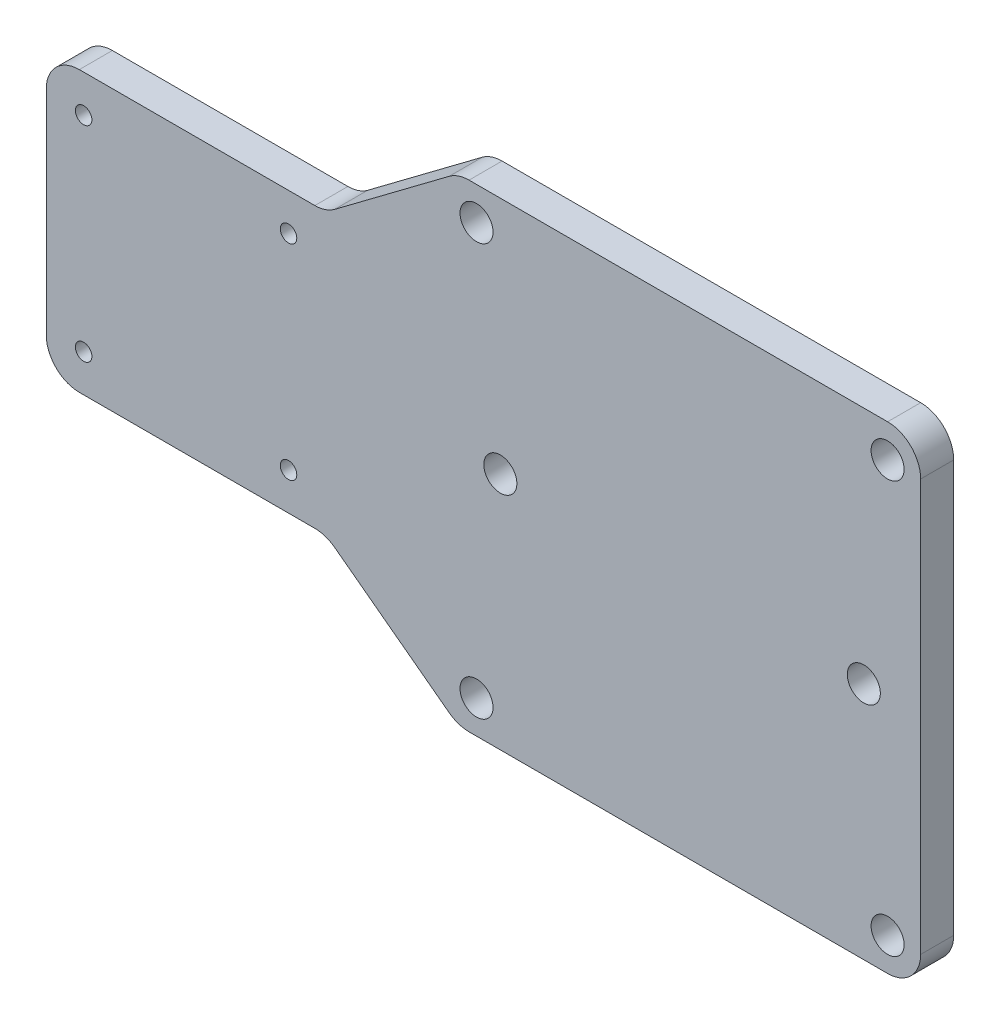
ISO-10303-21;
HEADER;
FILE_DESCRIPTION(('STEP AP214'),'2;1');
FILE_NAME('part.step','',(''),(''),'','','');
FILE_SCHEMA(('AUTOMOTIVE_DESIGN { 1 0 10303 214 1 1 1 1 }'));
ENDSEC;
DATA;
#1=APPLICATION_CONTEXT('core data for automotive mechanical design processes');
#2=APPLICATION_PROTOCOL_DEFINITION('international standard','automotive_design',2000,#1);
#3=PRODUCT_CONTEXT('',#1,'mechanical');
#4=PRODUCT('Part','Part','',(#3));
#5=PRODUCT_RELATED_PRODUCT_CATEGORY('part','',(#4));
#6=PRODUCT_DEFINITION_FORMATION('','',#4);
#7=PRODUCT_DEFINITION_CONTEXT('part definition',#1,'design');
#8=PRODUCT_DEFINITION('design','',#6,#7);
#9=PRODUCT_DEFINITION_SHAPE('','',#8);
#10=(LENGTH_UNIT() NAMED_UNIT(*) SI_UNIT(.MILLI.,.METRE.));
#11=(NAMED_UNIT(*) PLANE_ANGLE_UNIT() SI_UNIT($,.RADIAN.));
#12=(NAMED_UNIT(*) SI_UNIT($,.STERADIAN.) SOLID_ANGLE_UNIT());
#13=UNCERTAINTY_MEASURE_WITH_UNIT(LENGTH_MEASURE(1.E-05),#10,'distance_accuracy_value','');
#14=(GEOMETRIC_REPRESENTATION_CONTEXT(3) GLOBAL_UNCERTAINTY_ASSIGNED_CONTEXT((#13)) GLOBAL_UNIT_ASSIGNED_CONTEXT((#10,
#11,#12)) REPRESENTATION_CONTEXT('',''));
#15=CARTESIAN_POINT('',(0.,0.,0.));
#16=DIRECTION('',(0.,0.,1.));
#17=DIRECTION('',(1.,0.,0.));
#18=AXIS2_PLACEMENT_3D('',#15,#16,#17);
#19=CARTESIAN_POINT('',(-21.15,21.15,5.));
#20=DIRECTION('',(0.,-1.,0.));
#21=DIRECTION('',(0.,0.,-1.));
#22=AXIS2_PLACEMENT_3D('',#19,#20,#21);
#23=PLANE('',#22);
#24=DIRECTION('',(-1.,0.,0.));
#25=VECTOR('',#24,1.);
#26=CARTESIAN_POINT('',(-21.15,21.15,5.));
#27=LINE('',#26,#25);
#28=CARTESIAN_POINT('',(19.4833333333333,21.15,5.));
#29=VERTEX_POINT('',#28);
#30=CARTESIAN_POINT('',(-16.15,21.15,5.));
#31=VERTEX_POINT('',#30);
#32=EDGE_CURVE('E188',#29,#31,#27,.T.);
#33=ORIENTED_EDGE('',*,*,#32,.F.);
#34=DIRECTION('',(0.,0.,-1.));
#35=VECTOR('',#34,1.);
#36=CARTESIAN_POINT('',(19.4833333333333,21.15,0.));
#37=LINE('',#36,#35);
#38=CARTESIAN_POINT('',(19.4833333333333,21.15,0.));
#39=VERTEX_POINT('',#38);
#40=EDGE_CURVE('E204',#29,#39,#37,.T.);
#41=ORIENTED_EDGE('',*,*,#40,.T.);
#42=DIRECTION('',(-1.,0.,0.));
#43=VECTOR('',#42,1.);
#44=CARTESIAN_POINT('',(-21.15,21.15,0.));
#45=LINE('',#44,#43);
#46=CARTESIAN_POINT('',(-16.15,21.15,0.));
#47=VERTEX_POINT('',#46);
#48=EDGE_CURVE('E178',#39,#47,#45,.T.);
#49=ORIENTED_EDGE('',*,*,#48,.T.);
#50=DIRECTION('',(0.,0.,-1.));
#51=VECTOR('',#50,1.);
#52=CARTESIAN_POINT('',(-16.15,21.15,5.));
#53=LINE('',#52,#51);
#54=EDGE_CURVE('E199',#47,#31,#53,.F.);
#55=ORIENTED_EDGE('',*,*,#54,.T.);
#56=EDGE_LOOP('',(#33,#41,#49,#55));
#57=FACE_BOUND('',#56,.T.);
#58=ADVANCED_FACE('F33',(#57),#23,.F.);
#59=CARTESIAN_POINT('',(-21.15,-21.15,5.));
#60=DIRECTION('',(1.,0.,0.));
#61=DIRECTION('',(0.,0.,-1.));
#62=AXIS2_PLACEMENT_3D('',#59,#60,#61);
#63=PLANE('',#62);
#64=DIRECTION('',(0.,-1.,0.));
#65=VECTOR('',#64,1.);
#66=CARTESIAN_POINT('',(-21.15,-21.15,5.));
#67=LINE('',#66,#65);
#68=CARTESIAN_POINT('',(-21.15,16.15,5.));
#69=VERTEX_POINT('',#68);
#70=CARTESIAN_POINT('',(-21.15,-16.15,5.));
#71=VERTEX_POINT('',#70);
#72=EDGE_CURVE('E304',#69,#71,#67,.T.);
#73=ORIENTED_EDGE('',*,*,#72,.F.);
#74=DIRECTION('',(0.,0.,-1.));
#75=VECTOR('',#74,1.);
#76=CARTESIAN_POINT('',(-21.15,16.15,5.));
#77=LINE('',#76,#75);
#78=CARTESIAN_POINT('',(-21.15,16.15,0.));
#79=VERTEX_POINT('',#78);
#80=EDGE_CURVE('E193',#69,#79,#77,.T.);
#81=ORIENTED_EDGE('',*,*,#80,.T.);
#82=DIRECTION('',(0.,-1.,0.));
#83=VECTOR('',#82,1.);
#84=CARTESIAN_POINT('',(-21.15,-21.15,0.));
#85=LINE('',#84,#83);
#86=CARTESIAN_POINT('',(-21.15,-16.15,0.));
#87=VERTEX_POINT('',#86);
#88=EDGE_CURVE('E173',#79,#87,#85,.T.);
#89=ORIENTED_EDGE('',*,*,#88,.T.);
#90=DIRECTION('',(0.,0.,-1.));
#91=VECTOR('',#90,1.);
#92=CARTESIAN_POINT('',(-21.15,-16.15,5.));
#93=LINE('',#92,#91);
#94=EDGE_CURVE('E155',#87,#71,#93,.F.);
#95=ORIENTED_EDGE('',*,*,#94,.T.);
#96=EDGE_LOOP('',(#73,#81,#89,#95));
#97=FACE_BOUND('',#96,.T.);
#98=ADVANCED_FACE('F385',(#97),#63,.F.);
#99=CARTESIAN_POINT('',(-21.15,-21.15,5.));
#100=DIRECTION('',(0.,1.,0.));
#101=DIRECTION('',(0.,0.,1.));
#102=AXIS2_PLACEMENT_3D('',#99,#100,#101);
#103=PLANE('',#102);
#104=DIRECTION('',(1.,0.,0.));
#105=VECTOR('',#104,1.);
#106=CARTESIAN_POINT('',(-21.15,-21.15,0.));
#107=LINE('',#106,#105);
#108=CARTESIAN_POINT('',(-16.15,-21.15,0.));
#109=VERTEX_POINT('',#108);
#110=CARTESIAN_POINT('',(19.4833333333333,-21.15,0.));
#111=VERTEX_POINT('',#110);
#112=EDGE_CURVE('E163',#109,#111,#107,.T.);
#113=ORIENTED_EDGE('',*,*,#112,.T.);
#114=DIRECTION('',(0.,0.,-1.));
#115=VECTOR('',#114,1.);
#116=CARTESIAN_POINT('',(19.4833333333333,-21.15,5.));
#117=LINE('',#116,#115);
#118=CARTESIAN_POINT('',(19.4833333333333,-21.15,5.));
#119=VERTEX_POINT('',#118);
#120=EDGE_CURVE('E218',#111,#119,#117,.F.);
#121=ORIENTED_EDGE('',*,*,#120,.T.);
#122=DIRECTION('',(1.,0.,0.));
#123=VECTOR('',#122,1.);
#124=CARTESIAN_POINT('',(-21.15,-21.15,5.));
#125=LINE('',#124,#123);
#126=CARTESIAN_POINT('',(-16.15,-21.15,5.));
#127=VERTEX_POINT('',#126);
#128=EDGE_CURVE('E166',#127,#119,#125,.T.);
#129=ORIENTED_EDGE('',*,*,#128,.F.);
#130=DIRECTION('',(0.,0.,-1.));
#131=VECTOR('',#130,1.);
#132=CARTESIAN_POINT('',(-16.15,-21.15,5.));
#133=LINE('',#132,#131);
#134=EDGE_CURVE('E153',#127,#109,#133,.T.);
#135=ORIENTED_EDGE('',*,*,#134,.T.);
#136=EDGE_LOOP('',(#113,#121,#129,#135));
#137=FACE_BOUND('',#136,.T.);
#138=ADVANCED_FACE('F162',(#137),#103,.F.);
#139=CARTESIAN_POINT('',(21.15,-21.15,5.));
#140=DIRECTION('',(0.6,0.8,0.));
#141=DIRECTION('',(-0.8,0.6,0.));
#142=AXIS2_PLACEMENT_3D('',#139,#140,#141);
#143=PLANE('',#142);
#144=DIRECTION('',(0.8,-0.6,0.));
#145=VECTOR('',#144,1.);
#146=CARTESIAN_POINT('',(21.15,-21.15,0.));
#147=LINE('',#146,#145);
#148=CARTESIAN_POINT('',(22.4833333333333,-22.15,0.));
#149=VERTEX_POINT('',#148);
#150=CARTESIAN_POINT('',(39.8166666666667,-35.15,0.));
#151=VERTEX_POINT('',#150);
#152=EDGE_CURVE('E172',#149,#151,#147,.T.);
#153=ORIENTED_EDGE('',*,*,#152,.T.);
#154=DIRECTION('',(0.,0.,-1.));
#155=VECTOR('',#154,1.);
#156=CARTESIAN_POINT('',(39.8166666666667,-35.15,5.));
#157=LINE('',#156,#155);
#158=CARTESIAN_POINT('',(39.8166666666667,-35.15,5.));
#159=VERTEX_POINT('',#158);
#160=EDGE_CURVE('E228',#151,#159,#157,.F.);
#161=ORIENTED_EDGE('',*,*,#160,.T.);
#162=DIRECTION('',(0.8,-0.6,0.));
#163=VECTOR('',#162,1.);
#164=CARTESIAN_POINT('',(21.15,-21.15,5.));
#165=LINE('',#164,#163);
#166=CARTESIAN_POINT('',(22.4833333333333,-22.15,5.));
#167=VERTEX_POINT('',#166);
#168=EDGE_CURVE('E300',#167,#159,#165,.T.);
#169=ORIENTED_EDGE('',*,*,#168,.F.);
#170=DIRECTION('',(0.,0.,-1.));
#171=VECTOR('',#170,1.);
#172=CARTESIAN_POINT('',(22.4833333333333,-22.15,0.));
#173=LINE('',#172,#171);
#174=EDGE_CURVE('E215',#167,#149,#173,.T.);
#175=ORIENTED_EDGE('',*,*,#174,.T.);
#176=EDGE_LOOP('',(#153,#161,#169,#175));
#177=FACE_BOUND('',#176,.T.);
#178=ADVANCED_FACE('F392',(#177),#143,.F.);
#179=CARTESIAN_POINT('',(41.15,-36.15,5.));
#180=DIRECTION('',(0.,1.,0.));
#181=DIRECTION('',(0.,0.,1.));
#182=AXIS2_PLACEMENT_3D('',#179,#180,#181);
#183=PLANE('',#182);
#184=DIRECTION('',(1.,0.,0.));
#185=VECTOR('',#184,1.);
#186=CARTESIAN_POINT('',(41.15,-36.15,0.));
#187=LINE('',#186,#185);
#188=CARTESIAN_POINT('',(42.8166666666667,-36.15,0.));
#189=VERTEX_POINT('',#188);
#190=CARTESIAN_POINT('',(106.15,-36.15,0.));
#191=VERTEX_POINT('',#190);
#192=EDGE_CURVE('E176',#189,#191,#187,.T.);
#193=ORIENTED_EDGE('',*,*,#192,.T.);
#194=DIRECTION('',(0.,0.,-1.));
#195=VECTOR('',#194,1.);
#196=CARTESIAN_POINT('',(106.15,-36.15,5.));
#197=LINE('',#196,#195);
#198=CARTESIAN_POINT('',(106.15,-36.15,5.));
#199=VERTEX_POINT('',#198);
#200=EDGE_CURVE('E42',#191,#199,#197,.F.);
#201=ORIENTED_EDGE('',*,*,#200,.T.);
#202=DIRECTION('',(1.,0.,0.));
#203=VECTOR('',#202,1.);
#204=CARTESIAN_POINT('',(41.15,-36.15,5.));
#205=LINE('',#204,#203);
#206=CARTESIAN_POINT('',(42.8166666666667,-36.15,5.));
#207=VERTEX_POINT('',#206);
#208=EDGE_CURVE('E298',#207,#199,#205,.T.);
#209=ORIENTED_EDGE('',*,*,#208,.F.);
#210=DIRECTION('',(0.,0.,-1.));
#211=VECTOR('',#210,1.);
#212=CARTESIAN_POINT('',(42.8166666666667,-36.15,5.));
#213=LINE('',#212,#211);
#214=EDGE_CURVE('E223',#207,#189,#213,.T.);
#215=ORIENTED_EDGE('',*,*,#214,.T.);
#216=EDGE_LOOP('',(#193,#201,#209,#215));
#217=FACE_BOUND('',#216,.T.);
#218=ADVANCED_FACE('F396',(#217),#183,.F.);
#219=CARTESIAN_POINT('',(111.15,36.15,5.));
#220=DIRECTION('',(-1.,0.,0.));
#221=DIRECTION('',(0.,-1.,0.));
#222=AXIS2_PLACEMENT_3D('',#219,#220,#221);
#223=PLANE('',#222);
#224=DIRECTION('',(0.,1.,0.));
#225=VECTOR('',#224,1.);
#226=CARTESIAN_POINT('',(111.15,36.15,5.));
#227=LINE('',#226,#225);
#228=CARTESIAN_POINT('',(111.15,-31.15,5.));
#229=VERTEX_POINT('',#228);
#230=CARTESIAN_POINT('',(111.15,31.15,5.));
#231=VERTEX_POINT('',#230);
#232=EDGE_CURVE('E296',#229,#231,#227,.T.);
#233=ORIENTED_EDGE('',*,*,#232,.F.);
#234=DIRECTION('',(0.,0.,-1.));
#235=VECTOR('',#234,1.);
#236=CARTESIAN_POINT('',(111.15,-31.15,5.));
#237=LINE('',#236,#235);
#238=CARTESIAN_POINT('',(111.15,-31.15,0.));
#239=VERTEX_POINT('',#238);
#240=EDGE_CURVE('E254',#229,#239,#237,.T.);
#241=ORIENTED_EDGE('',*,*,#240,.T.);
#242=DIRECTION('',(0.,1.,0.));
#243=VECTOR('',#242,1.);
#244=CARTESIAN_POINT('',(111.15,36.15,0.));
#245=LINE('',#244,#243);
#246=CARTESIAN_POINT('',(111.15,31.15,0.));
#247=VERTEX_POINT('',#246);
#248=EDGE_CURVE('E183',#239,#247,#245,.T.);
#249=ORIENTED_EDGE('',*,*,#248,.T.);
#250=DIRECTION('',(0.,0.,-1.));
#251=VECTOR('',#250,1.);
#252=CARTESIAN_POINT('',(111.15,31.15,5.));
#253=LINE('',#252,#251);
#254=EDGE_CURVE('E249',#247,#231,#253,.F.);
#255=ORIENTED_EDGE('',*,*,#254,.T.);
#256=EDGE_LOOP('',(#233,#241,#249,#255));
#257=FACE_BOUND('',#256,.T.);
#258=ADVANCED_FACE('F354',(#257),#223,.F.);
#259=CARTESIAN_POINT('',(41.15,36.15,5.));
#260=DIRECTION('',(0.,-1.,0.));
#261=DIRECTION('',(0.,0.,-1.));
#262=AXIS2_PLACEMENT_3D('',#259,#260,#261);
#263=PLANE('',#262);
#264=DIRECTION('',(-1.,0.,0.));
#265=VECTOR('',#264,1.);
#266=CARTESIAN_POINT('',(41.15,36.15,5.));
#267=LINE('',#266,#265);
#268=CARTESIAN_POINT('',(106.15,36.15,5.));
#269=VERTEX_POINT('',#268);
#270=CARTESIAN_POINT('',(42.8166666666667,36.15,5.));
#271=VERTEX_POINT('',#270);
#272=EDGE_CURVE('E294',#269,#271,#267,.T.);
#273=ORIENTED_EDGE('',*,*,#272,.F.);
#274=DIRECTION('',(0.,0.,-1.));
#275=VECTOR('',#274,1.);
#276=CARTESIAN_POINT('',(106.15,36.15,5.));
#277=LINE('',#276,#275);
#278=CARTESIAN_POINT('',(106.15,36.15,0.));
#279=VERTEX_POINT('',#278);
#280=EDGE_CURVE('E243',#269,#279,#277,.T.);
#281=ORIENTED_EDGE('',*,*,#280,.T.);
#282=DIRECTION('',(-1.,0.,0.));
#283=VECTOR('',#282,1.);
#284=CARTESIAN_POINT('',(41.15,36.15,0.));
#285=LINE('',#284,#283);
#286=CARTESIAN_POINT('',(42.8166666666667,36.15,0.));
#287=VERTEX_POINT('',#286);
#288=EDGE_CURVE('E185',#279,#287,#285,.T.);
#289=ORIENTED_EDGE('',*,*,#288,.T.);
#290=DIRECTION('',(0.,0.,-1.));
#291=VECTOR('',#290,1.);
#292=CARTESIAN_POINT('',(42.8166666666667,36.15,5.));
#293=LINE('',#292,#291);
#294=EDGE_CURVE('E238',#287,#271,#293,.F.);
#295=ORIENTED_EDGE('',*,*,#294,.T.);
#296=EDGE_LOOP('',(#273,#281,#289,#295));
#297=FACE_BOUND('',#296,.T.);
#298=ADVANCED_FACE('F363',(#297),#263,.F.);
#299=CARTESIAN_POINT('',(21.15,21.15,5.));
#300=DIRECTION('',(0.6,-0.8,0.));
#301=DIRECTION('',(0.8,0.6,0.));
#302=AXIS2_PLACEMENT_3D('',#299,#300,#301);
#303=PLANE('',#302);
#304=DIRECTION('',(-0.8,-0.6,0.));
#305=VECTOR('',#304,1.);
#306=CARTESIAN_POINT('',(21.15,21.15,5.));
#307=LINE('',#306,#305);
#308=CARTESIAN_POINT('',(39.8166666666667,35.15,5.));
#309=VERTEX_POINT('',#308);
#310=CARTESIAN_POINT('',(22.4833333333333,22.15,5.));
#311=VERTEX_POINT('',#310);
#312=EDGE_CURVE('E167',#309,#311,#307,.T.);
#313=ORIENTED_EDGE('',*,*,#312,.F.);
#314=DIRECTION('',(0.,0.,-1.));
#315=VECTOR('',#314,1.);
#316=CARTESIAN_POINT('',(39.8166666666667,35.15,5.));
#317=LINE('',#316,#315);
#318=CARTESIAN_POINT('',(39.8166666666667,35.15,0.));
#319=VERTEX_POINT('',#318);
#320=EDGE_CURVE('E232',#309,#319,#317,.T.);
#321=ORIENTED_EDGE('',*,*,#320,.T.);
#322=DIRECTION('',(-0.8,-0.6,0.));
#323=VECTOR('',#322,1.);
#324=CARTESIAN_POINT('',(21.15,21.15,0.));
#325=LINE('',#324,#323);
#326=CARTESIAN_POINT('',(22.4833333333333,22.15,0.));
#327=VERTEX_POINT('',#326);
#328=EDGE_CURVE('E187',#319,#327,#325,.T.);
#329=ORIENTED_EDGE('',*,*,#328,.T.);
#330=DIRECTION('',(0.,0.,-1.));
#331=VECTOR('',#330,1.);
#332=CARTESIAN_POINT('',(22.4833333333333,22.15,5.));
#333=LINE('',#332,#331);
#334=EDGE_CURVE('E207',#327,#311,#333,.F.);
#335=ORIENTED_EDGE('',*,*,#334,.T.);
#336=EDGE_LOOP('',(#313,#321,#329,#335));
#337=FACE_BOUND('',#336,.T.);
#338=ADVANCED_FACE('F342',(#337),#303,.F.);
#339=CARTESIAN_POINT('',(0.,0.,5.));
#340=DIRECTION('',(0.,0.,-1.));
#341=DIRECTION('',(-1.,0.,0.));
#342=AXIS2_PLACEMENT_3D('',#339,#340,#341);
#343=PLANE('',#342);
#344=CARTESIAN_POINT('',(102.55,0.,5.));
#345=DIRECTION('',(0.,0.,1.));
#346=DIRECTION('',(1.,0.,0.));
#347=AXIS2_PLACEMENT_3D('',#344,#345,#346);
#348=CIRCLE('',#347,2.5);
#349=CARTESIAN_POINT('',(105.05,0.,5.));
#350=VERTEX_POINT('',#349);
#351=EDGE_CURVE('E322',#350,#350,#348,.T.);
#352=ORIENTED_EDGE('',*,*,#351,.F.);
#353=EDGE_LOOP('',(#352));
#354=FACE_BOUND('',#353,.T.);
#355=CARTESIAN_POINT('',(43.95,31.15,5.));
#356=DIRECTION('',(0.,0.,1.));
#357=DIRECTION('',(1.,0.,0.));
#358=AXIS2_PLACEMENT_3D('',#355,#356,#357);
#359=CIRCLE('',#358,2.5);
#360=CARTESIAN_POINT('',(46.45,31.15,5.));
#361=VERTEX_POINT('',#360);
#362=EDGE_CURVE('E325',#361,#361,#359,.T.);
#363=ORIENTED_EDGE('',*,*,#362,.F.);
#364=EDGE_LOOP('',(#363));
#365=FACE_BOUND('',#364,.T.);
#366=CARTESIAN_POINT('',(43.95,-31.15,5.));
#367=DIRECTION('',(0.,0.,1.));
#368=DIRECTION('',(1.,0.,0.));
#369=AXIS2_PLACEMENT_3D('',#366,#367,#368);
#370=CIRCLE('',#369,2.5);
#371=CARTESIAN_POINT('',(46.45,-31.15,5.));
#372=VERTEX_POINT('',#371);
#373=EDGE_CURVE('E329',#372,#372,#370,.T.);
#374=ORIENTED_EDGE('',*,*,#373,.F.);
#375=EDGE_LOOP('',(#374));
#376=FACE_BOUND('',#375,.T.);
#377=CARTESIAN_POINT('',(106.15,-31.15,5.));
#378=DIRECTION('',(0.,0.,1.));
#379=DIRECTION('',(1.,0.,0.));
#380=AXIS2_PLACEMENT_3D('',#377,#378,#379);
#381=CIRCLE('',#380,2.5);
#382=CARTESIAN_POINT('',(108.65,-31.15,5.));
#383=VERTEX_POINT('',#382);
#384=EDGE_CURVE('E319',#383,#383,#381,.T.);
#385=ORIENTED_EDGE('',*,*,#384,.F.);
#386=EDGE_LOOP('',(#385));
#387=FACE_BOUND('',#386,.T.);
#388=CARTESIAN_POINT('',(-15.5,15.5,5.));
#389=DIRECTION('',(0.,0.,1.));
#390=DIRECTION('',(1.,0.,0.));
#391=AXIS2_PLACEMENT_3D('',#388,#389,#390);
#392=CIRCLE('',#391,1.25);
#393=CARTESIAN_POINT('',(-14.25,15.5,5.));
#394=VERTEX_POINT('',#393);
#395=EDGE_CURVE('E309',#394,#394,#392,.T.);
#396=ORIENTED_EDGE('',*,*,#395,.F.);
#397=EDGE_LOOP('',(#396));
#398=FACE_BOUND('',#397,.T.);
#399=CARTESIAN_POINT('',(15.5,15.5,5.));
#400=DIRECTION('',(0.,0.,1.));
#401=DIRECTION('',(1.,0.,0.));
#402=AXIS2_PLACEMENT_3D('',#399,#400,#401);
#403=CIRCLE('',#402,1.25);
#404=CARTESIAN_POINT('',(16.75,15.5,5.));
#405=VERTEX_POINT('',#404);
#406=EDGE_CURVE('E310',#405,#405,#403,.T.);
#407=ORIENTED_EDGE('',*,*,#406,.F.);
#408=EDGE_LOOP('',(#407));
#409=FACE_BOUND('',#408,.T.);
#410=CARTESIAN_POINT('',(15.5,-15.5,5.));
#411=DIRECTION('',(0.,0.,1.));
#412=DIRECTION('',(1.,0.,0.));
#413=AXIS2_PLACEMENT_3D('',#410,#411,#412);
#414=CIRCLE('',#413,1.25);
#415=CARTESIAN_POINT('',(16.75,-15.5,5.));
#416=VERTEX_POINT('',#415);
#417=EDGE_CURVE('E313',#416,#416,#414,.T.);
#418=ORIENTED_EDGE('',*,*,#417,.F.);
#419=EDGE_LOOP('',(#418));
#420=FACE_BOUND('',#419,.T.);
#421=CARTESIAN_POINT('',(106.15,31.15,5.));
#422=DIRECTION('',(0.,0.,1.));
#423=DIRECTION('',(1.,0.,0.));
#424=AXIS2_PLACEMENT_3D('',#421,#422,#423);
#425=CIRCLE('',#424,2.5);
#426=CARTESIAN_POINT('',(108.65,31.15,5.));
#427=VERTEX_POINT('',#426);
#428=EDGE_CURVE('E316',#427,#427,#425,.T.);
#429=ORIENTED_EDGE('',*,*,#428,.F.);
#430=EDGE_LOOP('',(#429));
#431=FACE_BOUND('',#430,.T.);
#432=CARTESIAN_POINT('',(47.55,0.,5.));
#433=DIRECTION('',(0.,0.,1.));
#434=DIRECTION('',(1.,0.,0.));
#435=AXIS2_PLACEMENT_3D('',#432,#433,#434);
#436=CIRCLE('',#435,2.5);
#437=CARTESIAN_POINT('',(50.05,0.,5.));
#438=VERTEX_POINT('',#437);
#439=EDGE_CURVE('E326',#438,#438,#436,.T.);
#440=ORIENTED_EDGE('',*,*,#439,.F.);
#441=EDGE_LOOP('',(#440));
#442=FACE_BOUND('',#441,.T.);
#443=CARTESIAN_POINT('',(-15.5,-15.5,5.));
#444=DIRECTION('',(0.,0.,1.));
#445=DIRECTION('',(1.,0.,0.));
#446=AXIS2_PLACEMENT_3D('',#443,#444,#445);
#447=CIRCLE('',#446,1.25);
#448=CARTESIAN_POINT('',(-14.25,-15.5,5.));
#449=VERTEX_POINT('',#448);
#450=EDGE_CURVE('E263',#449,#449,#447,.T.);
#451=ORIENTED_EDGE('',*,*,#450,.F.);
#452=EDGE_LOOP('',(#451));
#453=FACE_BOUND('',#452,.T.);
#454=ORIENTED_EDGE('',*,*,#208,.T.);
#455=CARTESIAN_POINT('',(106.15,-31.15,5.));
#456=DIRECTION('',(0.,0.,-1.));
#457=DIRECTION('',(-1.,0.,0.));
#458=AXIS2_PLACEMENT_3D('',#455,#456,#457);
#459=CIRCLE('',#458,5.);
#460=EDGE_CURVE('E11',#199,#229,#459,.F.);
#461=ORIENTED_EDGE('',*,*,#460,.T.);
#462=ORIENTED_EDGE('',*,*,#232,.T.);
#463=CARTESIAN_POINT('',(106.15,31.15,5.));
#464=DIRECTION('',(0.,0.,-1.));
#465=DIRECTION('',(-1.,0.,0.));
#466=AXIS2_PLACEMENT_3D('',#463,#464,#465);
#467=CIRCLE('',#466,5.);
#468=EDGE_CURVE('E252',#231,#269,#467,.F.);
#469=ORIENTED_EDGE('',*,*,#468,.T.);
#470=ORIENTED_EDGE('',*,*,#272,.T.);
#471=CARTESIAN_POINT('',(42.8166666666667,31.15,5.));
#472=DIRECTION('',(0.,0.,-1.));
#473=DIRECTION('',(-1.,0.,0.));
#474=AXIS2_PLACEMENT_3D('',#471,#472,#473);
#475=CIRCLE('',#474,5.);
#476=EDGE_CURVE('E241',#271,#309,#475,.F.);
#477=ORIENTED_EDGE('',*,*,#476,.T.);
#478=ORIENTED_EDGE('',*,*,#312,.T.);
#479=CARTESIAN_POINT('',(19.4833333333333,26.15,5.));
#480=DIRECTION('',(0.,0.,-1.));
#481=DIRECTION('',(-1.,0.,0.));
#482=AXIS2_PLACEMENT_3D('',#479,#480,#481);
#483=CIRCLE('',#482,5.);
#484=EDGE_CURVE('E213',#311,#29,#483,.T.);
#485=ORIENTED_EDGE('',*,*,#484,.T.);
#486=ORIENTED_EDGE('',*,*,#32,.T.);
#487=CARTESIAN_POINT('',(-16.15,16.15,5.));
#488=DIRECTION('',(0.,0.,-1.));
#489=DIRECTION('',(-1.,0.,0.));
#490=AXIS2_PLACEMENT_3D('',#487,#488,#489);
#491=CIRCLE('',#490,5.);
#492=EDGE_CURVE('E202',#31,#69,#491,.F.);
#493=ORIENTED_EDGE('',*,*,#492,.T.);
#494=ORIENTED_EDGE('',*,*,#72,.T.);
#495=CARTESIAN_POINT('',(-16.15,-16.15,5.));
#496=DIRECTION('',(0.,0.,-1.));
#497=DIRECTION('',(-1.,0.,0.));
#498=AXIS2_PLACEMENT_3D('',#495,#496,#497);
#499=CIRCLE('',#498,5.);
#500=EDGE_CURVE('E191',#71,#127,#499,.F.);
#501=ORIENTED_EDGE('',*,*,#500,.T.);
#502=ORIENTED_EDGE('',*,*,#128,.T.);
#503=CARTESIAN_POINT('',(19.4833333333333,-26.15,5.));
#504=DIRECTION('',(0.,0.,-1.));
#505=DIRECTION('',(-1.,0.,0.));
#506=AXIS2_PLACEMENT_3D('',#503,#504,#505);
#507=CIRCLE('',#506,5.);
#508=EDGE_CURVE('E221',#119,#167,#507,.T.);
#509=ORIENTED_EDGE('',*,*,#508,.T.);
#510=ORIENTED_EDGE('',*,*,#168,.T.);
#511=CARTESIAN_POINT('',(42.8166666666667,-31.15,5.));
#512=DIRECTION('',(0.,0.,-1.));
#513=DIRECTION('',(-1.,0.,0.));
#514=AXIS2_PLACEMENT_3D('',#511,#512,#513);
#515=CIRCLE('',#514,5.);
#516=EDGE_CURVE('E230',#159,#207,#515,.F.);
#517=ORIENTED_EDGE('',*,*,#516,.T.);
#518=EDGE_LOOP('',(#454,#461,#462,#469,#470,#477,#478,#485,#486,#493,#494,#501,#502,#509,#510,#517));
#519=FACE_BOUND('',#518,.T.);
#520=ADVANCED_FACE('F339',(#354,#365,#376,#387,#398,#409,#420,#431,#442,#453,#519),#343,.F.);
#521=CARTESIAN_POINT('',(0.,0.,0.));
#522=DIRECTION('',(0.,0.,-1.));
#523=DIRECTION('',(-1.,0.,0.));
#524=AXIS2_PLACEMENT_3D('',#521,#522,#523);
#525=PLANE('',#524);
#526=CARTESIAN_POINT('',(102.55,0.,0.));
#527=DIRECTION('',(0.,0.,-1.));
#528=DIRECTION('',(-1.,0.,0.));
#529=AXIS2_PLACEMENT_3D('',#526,#527,#528);
#530=CIRCLE('',#529,2.5);
#531=CARTESIAN_POINT('',(100.05,0.,0.));
#532=VERTEX_POINT('',#531);
#533=EDGE_CURVE('E37',#532,#532,#530,.T.);
#534=ORIENTED_EDGE('',*,*,#533,.F.);
#535=EDGE_LOOP('',(#534));
#536=FACE_BOUND('',#535,.T.);
#537=CARTESIAN_POINT('',(43.95,31.15,0.));
#538=DIRECTION('',(0.,0.,-1.));
#539=DIRECTION('',(-1.,0.,0.));
#540=AXIS2_PLACEMENT_3D('',#537,#538,#539);
#541=CIRCLE('',#540,2.5);
#542=CARTESIAN_POINT('',(41.45,31.15,0.));
#543=VERTEX_POINT('',#542);
#544=EDGE_CURVE('E283',#543,#543,#541,.T.);
#545=ORIENTED_EDGE('',*,*,#544,.F.);
#546=EDGE_LOOP('',(#545));
#547=FACE_BOUND('',#546,.T.);
#548=CARTESIAN_POINT('',(43.95,-31.15,0.));
#549=DIRECTION('',(0.,0.,-1.));
#550=DIRECTION('',(-1.,0.,0.));
#551=AXIS2_PLACEMENT_3D('',#548,#549,#550);
#552=CIRCLE('',#551,2.5);
#553=CARTESIAN_POINT('',(41.45,-31.15,0.));
#554=VERTEX_POINT('',#553);
#555=EDGE_CURVE('E281',#554,#554,#552,.T.);
#556=ORIENTED_EDGE('',*,*,#555,.F.);
#557=EDGE_LOOP('',(#556));
#558=FACE_BOUND('',#557,.T.);
#559=CARTESIAN_POINT('',(106.15,-31.15,0.));
#560=DIRECTION('',(0.,0.,-1.));
#561=DIRECTION('',(-1.,0.,0.));
#562=AXIS2_PLACEMENT_3D('',#559,#560,#561);
#563=CIRCLE('',#562,2.5);
#564=CARTESIAN_POINT('',(103.65,-31.15,0.));
#565=VERTEX_POINT('',#564);
#566=EDGE_CURVE('E278',#565,#565,#563,.T.);
#567=ORIENTED_EDGE('',*,*,#566,.F.);
#568=EDGE_LOOP('',(#567));
#569=FACE_BOUND('',#568,.T.);
#570=CARTESIAN_POINT('',(-15.5,15.5,0.));
#571=DIRECTION('',(0.,0.,-1.));
#572=DIRECTION('',(-1.,0.,0.));
#573=AXIS2_PLACEMENT_3D('',#570,#571,#572);
#574=CIRCLE('',#573,1.25);
#575=CARTESIAN_POINT('',(-16.75,15.5,0.));
#576=VERTEX_POINT('',#575);
#577=EDGE_CURVE('E275',#576,#576,#574,.T.);
#578=ORIENTED_EDGE('',*,*,#577,.F.);
#579=EDGE_LOOP('',(#578));
#580=FACE_BOUND('',#579,.T.);
#581=CARTESIAN_POINT('',(15.5,15.5,0.));
#582=DIRECTION('',(0.,0.,-1.));
#583=DIRECTION('',(-1.,0.,0.));
#584=AXIS2_PLACEMENT_3D('',#581,#582,#583);
#585=CIRCLE('',#584,1.25);
#586=CARTESIAN_POINT('',(14.25,15.5,0.));
#587=VERTEX_POINT('',#586);
#588=EDGE_CURVE('E272',#587,#587,#585,.T.);
#589=ORIENTED_EDGE('',*,*,#588,.F.);
#590=EDGE_LOOP('',(#589));
#591=FACE_BOUND('',#590,.T.);
#592=CARTESIAN_POINT('',(15.5,-15.5,0.));
#593=DIRECTION('',(0.,0.,-1.));
#594=DIRECTION('',(-1.,0.,0.));
#595=AXIS2_PLACEMENT_3D('',#592,#593,#594);
#596=CIRCLE('',#595,1.25);
#597=CARTESIAN_POINT('',(14.25,-15.5,0.));
#598=VERTEX_POINT('',#597);
#599=EDGE_CURVE('E269',#598,#598,#596,.T.);
#600=ORIENTED_EDGE('',*,*,#599,.F.);
#601=EDGE_LOOP('',(#600));
#602=FACE_BOUND('',#601,.T.);
#603=CARTESIAN_POINT('',(106.15,31.15,0.));
#604=DIRECTION('',(0.,0.,-1.));
#605=DIRECTION('',(-1.,0.,0.));
#606=AXIS2_PLACEMENT_3D('',#603,#604,#605);
#607=CIRCLE('',#606,2.5);
#608=CARTESIAN_POINT('',(103.65,31.15,0.));
#609=VERTEX_POINT('',#608);
#610=EDGE_CURVE('E266',#609,#609,#607,.T.);
#611=ORIENTED_EDGE('',*,*,#610,.F.);
#612=EDGE_LOOP('',(#611));
#613=FACE_BOUND('',#612,.T.);
#614=CARTESIAN_POINT('',(47.55,0.,0.));
#615=DIRECTION('',(0.,0.,-1.));
#616=DIRECTION('',(-1.,0.,0.));
#617=AXIS2_PLACEMENT_3D('',#614,#615,#616);
#618=CIRCLE('',#617,2.5);
#619=CARTESIAN_POINT('',(45.05,0.,0.));
#620=VERTEX_POINT('',#619);
#621=EDGE_CURVE('E262',#620,#620,#618,.T.);
#622=ORIENTED_EDGE('',*,*,#621,.F.);
#623=EDGE_LOOP('',(#622));
#624=FACE_BOUND('',#623,.T.);
#625=CARTESIAN_POINT('',(-15.5,-15.5,0.));
#626=DIRECTION('',(0.,0.,-1.));
#627=DIRECTION('',(-1.,0.,0.));
#628=AXIS2_PLACEMENT_3D('',#625,#626,#627);
#629=CIRCLE('',#628,1.25);
#630=CARTESIAN_POINT('',(-16.75,-15.5,0.));
#631=VERTEX_POINT('',#630);
#632=EDGE_CURVE('E259',#631,#631,#629,.T.);
#633=ORIENTED_EDGE('',*,*,#632,.F.);
#634=EDGE_LOOP('',(#633));
#635=FACE_BOUND('',#634,.T.);
#636=ORIENTED_EDGE('',*,*,#248,.F.);
#637=CARTESIAN_POINT('',(106.15,-31.15,0.));
#638=DIRECTION('',(0.,0.,-1.));
#639=DIRECTION('',(-1.,0.,0.));
#640=AXIS2_PLACEMENT_3D('',#637,#638,#639);
#641=CIRCLE('',#640,5.);
#642=EDGE_CURVE('E57',#239,#191,#641,.T.);
#643=ORIENTED_EDGE('',*,*,#642,.T.);
#644=ORIENTED_EDGE('',*,*,#192,.F.);
#645=CARTESIAN_POINT('',(42.8166666666667,-31.15,0.));
#646=DIRECTION('',(0.,0.,-1.));
#647=DIRECTION('',(-1.,0.,0.));
#648=AXIS2_PLACEMENT_3D('',#645,#646,#647);
#649=CIRCLE('',#648,5.);
#650=EDGE_CURVE('E226',#189,#151,#649,.T.);
#651=ORIENTED_EDGE('',*,*,#650,.T.);
#652=ORIENTED_EDGE('',*,*,#152,.F.);
#653=CARTESIAN_POINT('',(19.4833333333333,-26.15,0.));
#654=DIRECTION('',(0.,0.,-1.));
#655=DIRECTION('',(-1.,0.,0.));
#656=AXIS2_PLACEMENT_3D('',#653,#654,#655);
#657=CIRCLE('',#656,5.);
#658=EDGE_CURVE('E171',#149,#111,#657,.F.);
#659=ORIENTED_EDGE('',*,*,#658,.T.);
#660=ORIENTED_EDGE('',*,*,#112,.F.);
#661=CARTESIAN_POINT('',(-16.15,-16.15,0.));
#662=DIRECTION('',(0.,0.,-1.));
#663=DIRECTION('',(-1.,0.,0.));
#664=AXIS2_PLACEMENT_3D('',#661,#662,#663);
#665=CIRCLE('',#664,5.);
#666=EDGE_CURVE('E149',#109,#87,#665,.T.);
#667=ORIENTED_EDGE('',*,*,#666,.T.);
#668=ORIENTED_EDGE('',*,*,#88,.F.);
#669=CARTESIAN_POINT('',(-16.15,16.15,0.));
#670=DIRECTION('',(0.,0.,-1.));
#671=DIRECTION('',(-1.,0.,0.));
#672=AXIS2_PLACEMENT_3D('',#669,#670,#671);
#673=CIRCLE('',#672,5.);
#674=EDGE_CURVE('E196',#79,#47,#673,.T.);
#675=ORIENTED_EDGE('',*,*,#674,.T.);
#676=ORIENTED_EDGE('',*,*,#48,.F.);
#677=CARTESIAN_POINT('',(19.4833333333333,26.15,0.));
#678=DIRECTION('',(0.,0.,-1.));
#679=DIRECTION('',(-1.,0.,0.));
#680=AXIS2_PLACEMENT_3D('',#677,#678,#679);
#681=CIRCLE('',#680,5.);
#682=EDGE_CURVE('E210',#39,#327,#681,.F.);
#683=ORIENTED_EDGE('',*,*,#682,.T.);
#684=ORIENTED_EDGE('',*,*,#328,.F.);
#685=CARTESIAN_POINT('',(42.8166666666667,31.15,0.));
#686=DIRECTION('',(0.,0.,-1.));
#687=DIRECTION('',(-1.,0.,0.));
#688=AXIS2_PLACEMENT_3D('',#685,#686,#687);
#689=CIRCLE('',#688,5.);
#690=EDGE_CURVE('E235',#319,#287,#689,.T.);
#691=ORIENTED_EDGE('',*,*,#690,.T.);
#692=ORIENTED_EDGE('',*,*,#288,.F.);
#693=CARTESIAN_POINT('',(106.15,31.15,0.));
#694=DIRECTION('',(0.,0.,-1.));
#695=DIRECTION('',(-1.,0.,0.));
#696=AXIS2_PLACEMENT_3D('',#693,#694,#695);
#697=CIRCLE('',#696,5.);
#698=EDGE_CURVE('E246',#279,#247,#697,.T.);
#699=ORIENTED_EDGE('',*,*,#698,.T.);
#700=EDGE_LOOP('',(#636,#643,#644,#651,#652,#659,#660,#667,#668,#675,#676,#683,#684,#691,#692,#699));
#701=FACE_BOUND('',#700,.T.);
#702=ADVANCED_FACE('F169',(#536,#547,#558,#569,#580,#591,#602,#613,#624,#635,#701),#525,.T.);
#703=CARTESIAN_POINT('',(-16.15,-16.15,5.));
#704=DIRECTION('',(0.,0.,-1.));
#705=DIRECTION('',(-1.,0.,0.));
#706=AXIS2_PLACEMENT_3D('',#703,#704,#705);
#707=CYLINDRICAL_SURFACE('',#706,5.);
#708=ORIENTED_EDGE('',*,*,#500,.F.);
#709=ORIENTED_EDGE('',*,*,#94,.F.);
#710=ORIENTED_EDGE('',*,*,#666,.F.);
#711=ORIENTED_EDGE('',*,*,#134,.F.);
#712=EDGE_LOOP('',(#708,#709,#710,#711));
#713=FACE_BOUND('',#712,.T.);
#714=ADVANCED_FACE('F152',(#713),#707,.T.);
#715=CARTESIAN_POINT('',(-16.15,16.15,5.));
#716=DIRECTION('',(0.,0.,-1.));
#717=DIRECTION('',(-1.,0.,0.));
#718=AXIS2_PLACEMENT_3D('',#715,#716,#717);
#719=CYLINDRICAL_SURFACE('',#718,5.);
#720=ORIENTED_EDGE('',*,*,#492,.F.);
#721=ORIENTED_EDGE('',*,*,#54,.F.);
#722=ORIENTED_EDGE('',*,*,#674,.F.);
#723=ORIENTED_EDGE('',*,*,#80,.F.);
#724=EDGE_LOOP('',(#720,#721,#722,#723));
#725=FACE_BOUND('',#724,.T.);
#726=ADVANCED_FACE('F382',(#725),#719,.T.);
#727=CARTESIAN_POINT('',(19.4833333333333,26.15,5.));
#728=DIRECTION('',(0.,0.,1.));
#729=DIRECTION('',(1.,0.,0.));
#730=AXIS2_PLACEMENT_3D('',#727,#728,#729);
#731=CYLINDRICAL_SURFACE('',#730,5.);
#732=ORIENTED_EDGE('',*,*,#484,.F.);
#733=ORIENTED_EDGE('',*,*,#334,.F.);
#734=ORIENTED_EDGE('',*,*,#682,.F.);
#735=ORIENTED_EDGE('',*,*,#40,.F.);
#736=EDGE_LOOP('',(#732,#733,#734,#735));
#737=FACE_BOUND('',#736,.T.);
#738=ADVANCED_FACE('F376',(#737),#731,.F.);
#739=CARTESIAN_POINT('',(19.4833333333333,-26.15,5.));
#740=DIRECTION('',(0.,0.,1.));
#741=DIRECTION('',(1.,0.,0.));
#742=AXIS2_PLACEMENT_3D('',#739,#740,#741);
#743=CYLINDRICAL_SURFACE('',#742,5.);
#744=ORIENTED_EDGE('',*,*,#508,.F.);
#745=ORIENTED_EDGE('',*,*,#120,.F.);
#746=ORIENTED_EDGE('',*,*,#658,.F.);
#747=ORIENTED_EDGE('',*,*,#174,.F.);
#748=EDGE_LOOP('',(#744,#745,#746,#747));
#749=FACE_BOUND('',#748,.T.);
#750=ADVANCED_FACE('F390',(#749),#743,.F.);
#751=CARTESIAN_POINT('',(42.8166666666667,-31.15,5.));
#752=DIRECTION('',(0.,0.,-1.));
#753=DIRECTION('',(-1.,0.,0.));
#754=AXIS2_PLACEMENT_3D('',#751,#752,#753);
#755=CYLINDRICAL_SURFACE('',#754,5.);
#756=ORIENTED_EDGE('',*,*,#516,.F.);
#757=ORIENTED_EDGE('',*,*,#160,.F.);
#758=ORIENTED_EDGE('',*,*,#650,.F.);
#759=ORIENTED_EDGE('',*,*,#214,.F.);
#760=EDGE_LOOP('',(#756,#757,#758,#759));
#761=FACE_BOUND('',#760,.T.);
#762=ADVANCED_FACE('F395',(#761),#755,.T.);
#763=CARTESIAN_POINT('',(42.8166666666667,31.15,5.));
#764=DIRECTION('',(0.,0.,-1.));
#765=DIRECTION('',(-1.,0.,0.));
#766=AXIS2_PLACEMENT_3D('',#763,#764,#765);
#767=CYLINDRICAL_SURFACE('',#766,5.);
#768=ORIENTED_EDGE('',*,*,#476,.F.);
#769=ORIENTED_EDGE('',*,*,#294,.F.);
#770=ORIENTED_EDGE('',*,*,#690,.F.);
#771=ORIENTED_EDGE('',*,*,#320,.F.);
#772=EDGE_LOOP('',(#768,#769,#770,#771));
#773=FACE_BOUND('',#772,.T.);
#774=ADVANCED_FACE('F368',(#773),#767,.T.);
#775=CARTESIAN_POINT('',(106.15,31.15,5.));
#776=DIRECTION('',(0.,0.,-1.));
#777=DIRECTION('',(-1.,0.,0.));
#778=AXIS2_PLACEMENT_3D('',#775,#776,#777);
#779=CYLINDRICAL_SURFACE('',#778,5.);
#780=ORIENTED_EDGE('',*,*,#468,.F.);
#781=ORIENTED_EDGE('',*,*,#254,.F.);
#782=ORIENTED_EDGE('',*,*,#698,.F.);
#783=ORIENTED_EDGE('',*,*,#280,.F.);
#784=EDGE_LOOP('',(#780,#781,#782,#783));
#785=FACE_BOUND('',#784,.T.);
#786=ADVANCED_FACE('F360',(#785),#779,.T.);
#787=CARTESIAN_POINT('',(106.15,-31.15,5.));
#788=DIRECTION('',(0.,0.,-1.));
#789=DIRECTION('',(-1.,0.,0.));
#790=AXIS2_PLACEMENT_3D('',#787,#788,#789);
#791=CYLINDRICAL_SURFACE('',#790,5.);
#792=ORIENTED_EDGE('',*,*,#460,.F.);
#793=ORIENTED_EDGE('',*,*,#200,.F.);
#794=ORIENTED_EDGE('',*,*,#642,.F.);
#795=ORIENTED_EDGE('',*,*,#240,.F.);
#796=EDGE_LOOP('',(#792,#793,#794,#795));
#797=FACE_BOUND('',#796,.T.);
#798=ADVANCED_FACE('F35',(#797),#791,.T.);
#799=CARTESIAN_POINT('',(-15.5,-15.5,-5.));
#800=DIRECTION('',(0.,0.,1.));
#801=DIRECTION('',(1.,0.,0.));
#802=AXIS2_PLACEMENT_3D('',#799,#800,#801);
#803=CYLINDRICAL_SURFACE('',#802,1.25);
#804=ORIENTED_EDGE('',*,*,#632,.T.);
#805=EDGE_LOOP('',(#804));
#806=FACE_BOUND('',#805,.T.);
#807=ORIENTED_EDGE('',*,*,#450,.T.);
#808=EDGE_LOOP('',(#807));
#809=FACE_BOUND('',#808,.T.);
#810=ADVANCED_FACE('F428',(#806,#809),#803,.F.);
#811=CARTESIAN_POINT('',(47.55,0.,-5.));
#812=DIRECTION('',(0.,0.,1.));
#813=DIRECTION('',(1.,0.,0.));
#814=AXIS2_PLACEMENT_3D('',#811,#812,#813);
#815=CYLINDRICAL_SURFACE('',#814,2.5);
#816=ORIENTED_EDGE('',*,*,#621,.T.);
#817=EDGE_LOOP('',(#816));
#818=FACE_BOUND('',#817,.T.);
#819=ORIENTED_EDGE('',*,*,#439,.T.);
#820=EDGE_LOOP('',(#819));
#821=FACE_BOUND('',#820,.T.);
#822=ADVANCED_FACE('F337',(#818,#821),#815,.F.);
#823=CARTESIAN_POINT('',(106.15,31.15,-5.));
#824=DIRECTION('',(0.,0.,1.));
#825=DIRECTION('',(1.,0.,0.));
#826=AXIS2_PLACEMENT_3D('',#823,#824,#825);
#827=CYLINDRICAL_SURFACE('',#826,2.5);
#828=ORIENTED_EDGE('',*,*,#610,.T.);
#829=EDGE_LOOP('',(#828));
#830=FACE_BOUND('',#829,.T.);
#831=ORIENTED_EDGE('',*,*,#428,.T.);
#832=EDGE_LOOP('',(#831));
#833=FACE_BOUND('',#832,.T.);
#834=ADVANCED_FACE('F437',(#830,#833),#827,.F.);
#835=CARTESIAN_POINT('',(15.5,-15.5,-5.));
#836=DIRECTION('',(0.,0.,1.));
#837=DIRECTION('',(1.,0.,0.));
#838=AXIS2_PLACEMENT_3D('',#835,#836,#837);
#839=CYLINDRICAL_SURFACE('',#838,1.25);
#840=ORIENTED_EDGE('',*,*,#599,.T.);
#841=EDGE_LOOP('',(#840));
#842=FACE_BOUND('',#841,.T.);
#843=ORIENTED_EDGE('',*,*,#417,.T.);
#844=EDGE_LOOP('',(#843));
#845=FACE_BOUND('',#844,.T.);
#846=ADVANCED_FACE('F523',(#842,#845),#839,.F.);
#847=CARTESIAN_POINT('',(15.5,15.5,-5.));
#848=DIRECTION('',(0.,0.,1.));
#849=DIRECTION('',(1.,0.,0.));
#850=AXIS2_PLACEMENT_3D('',#847,#848,#849);
#851=CYLINDRICAL_SURFACE('',#850,1.25);
#852=ORIENTED_EDGE('',*,*,#588,.T.);
#853=EDGE_LOOP('',(#852));
#854=FACE_BOUND('',#853,.T.);
#855=ORIENTED_EDGE('',*,*,#406,.T.);
#856=EDGE_LOOP('',(#855));
#857=FACE_BOUND('',#856,.T.);
#858=ADVANCED_FACE('F442',(#854,#857),#851,.F.);
#859=CARTESIAN_POINT('',(-15.5,15.5,-5.));
#860=DIRECTION('',(0.,0.,1.));
#861=DIRECTION('',(1.,0.,0.));
#862=AXIS2_PLACEMENT_3D('',#859,#860,#861);
#863=CYLINDRICAL_SURFACE('',#862,1.25);
#864=ORIENTED_EDGE('',*,*,#577,.T.);
#865=EDGE_LOOP('',(#864));
#866=FACE_BOUND('',#865,.T.);
#867=ORIENTED_EDGE('',*,*,#395,.T.);
#868=EDGE_LOOP('',(#867));
#869=FACE_BOUND('',#868,.T.);
#870=ADVANCED_FACE('F540',(#866,#869),#863,.F.);
#871=CARTESIAN_POINT('',(106.15,-31.15,-5.));
#872=DIRECTION('',(0.,0.,1.));
#873=DIRECTION('',(1.,0.,0.));
#874=AXIS2_PLACEMENT_3D('',#871,#872,#873);
#875=CYLINDRICAL_SURFACE('',#874,2.5);
#876=ORIENTED_EDGE('',*,*,#566,.T.);
#877=EDGE_LOOP('',(#876));
#878=FACE_BOUND('',#877,.T.);
#879=ORIENTED_EDGE('',*,*,#384,.T.);
#880=EDGE_LOOP('',(#879));
#881=FACE_BOUND('',#880,.T.);
#882=ADVANCED_FACE('F548',(#878,#881),#875,.F.);
#883=CARTESIAN_POINT('',(43.95,-31.15,-5.));
#884=DIRECTION('',(0.,0.,1.));
#885=DIRECTION('',(1.,0.,0.));
#886=AXIS2_PLACEMENT_3D('',#883,#884,#885);
#887=CYLINDRICAL_SURFACE('',#886,2.5);
#888=ORIENTED_EDGE('',*,*,#555,.T.);
#889=EDGE_LOOP('',(#888));
#890=FACE_BOUND('',#889,.T.);
#891=ORIENTED_EDGE('',*,*,#373,.T.);
#892=EDGE_LOOP('',(#891));
#893=FACE_BOUND('',#892,.T.);
#894=ADVANCED_FACE('F556',(#890,#893),#887,.F.);
#895=CARTESIAN_POINT('',(43.95,31.15,-5.));
#896=DIRECTION('',(0.,0.,1.));
#897=DIRECTION('',(1.,0.,0.));
#898=AXIS2_PLACEMENT_3D('',#895,#896,#897);
#899=CYLINDRICAL_SURFACE('',#898,2.5);
#900=ORIENTED_EDGE('',*,*,#544,.T.);
#901=EDGE_LOOP('',(#900));
#902=FACE_BOUND('',#901,.T.);
#903=ORIENTED_EDGE('',*,*,#362,.T.);
#904=EDGE_LOOP('',(#903));
#905=FACE_BOUND('',#904,.T.);
#906=ADVANCED_FACE('F565',(#902,#905),#899,.F.);
#907=CARTESIAN_POINT('',(102.55,0.,-5.));
#908=DIRECTION('',(0.,0.,1.));
#909=DIRECTION('',(1.,0.,0.));
#910=AXIS2_PLACEMENT_3D('',#907,#908,#909);
#911=CYLINDRICAL_SURFACE('',#910,2.5);
#912=ORIENTED_EDGE('',*,*,#533,.T.);
#913=EDGE_LOOP('',(#912));
#914=FACE_BOUND('',#913,.T.);
#915=ORIENTED_EDGE('',*,*,#351,.T.);
#916=EDGE_LOOP('',(#915));
#917=FACE_BOUND('',#916,.T.);
#918=ADVANCED_FACE('F574',(#914,#917),#911,.F.);
#919=CLOSED_SHELL('',(#58,#98,#138,#178,#218,#258,#298,#338,#520,#702,#714,#726,#738,#750,#762,
#774,#786,#798,#810,#822,#834,#846,#858,#870,#882,#894,#906,#918));
#920=MANIFOLD_SOLID_BREP('B2',#919);
#921=ADVANCED_BREP_SHAPE_REPRESENTATION('',(#18,#920),#14);
#922=SHAPE_DEFINITION_REPRESENTATION(#9,#921);
ENDSEC;
END-ISO-10303-21;
